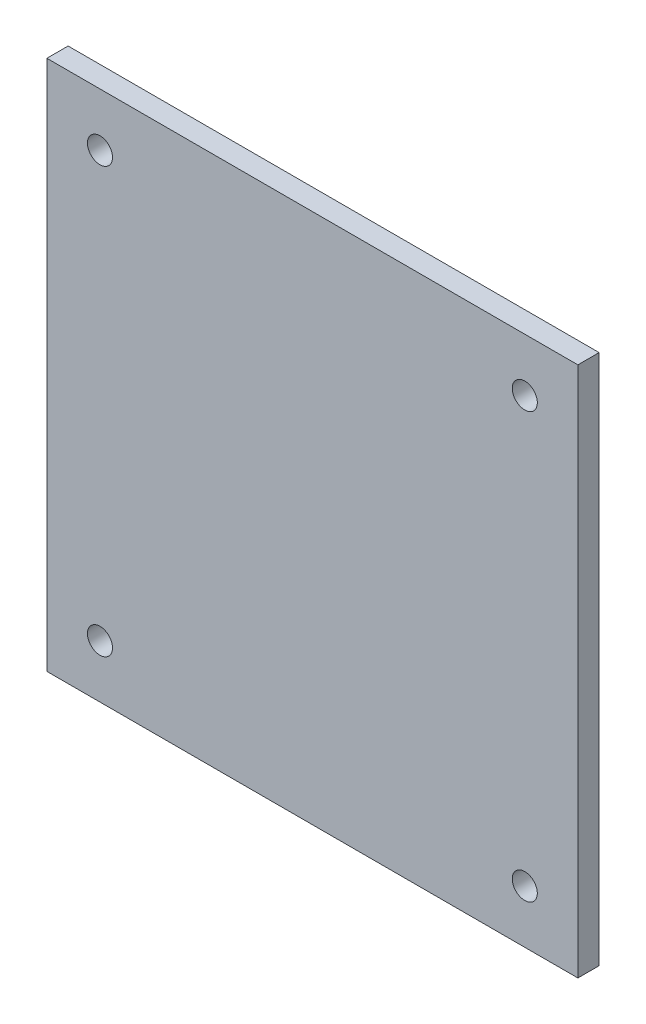
ISO-10303-21;
HEADER;
FILE_DESCRIPTION(('STEP AP214'),'2;1');
FILE_NAME('part.step','',(''),(''),'','','');
FILE_SCHEMA(('AUTOMOTIVE_DESIGN { 1 0 10303 214 1 1 1 1 }'));
ENDSEC;
DATA;
#1=APPLICATION_CONTEXT('core data for automotive mechanical design processes');
#2=APPLICATION_PROTOCOL_DEFINITION('international standard','automotive_design',2000,#1);
#3=PRODUCT_CONTEXT('',#1,'mechanical');
#4=PRODUCT('Part','Part','',(#3));
#5=PRODUCT_RELATED_PRODUCT_CATEGORY('part','',(#4));
#6=PRODUCT_DEFINITION_FORMATION('','',#4);
#7=PRODUCT_DEFINITION_CONTEXT('part definition',#1,'design');
#8=PRODUCT_DEFINITION('design','',#6,#7);
#9=PRODUCT_DEFINITION_SHAPE('','',#8);
#10=(LENGTH_UNIT() NAMED_UNIT(*) SI_UNIT(.MILLI.,.METRE.));
#11=(NAMED_UNIT(*) PLANE_ANGLE_UNIT() SI_UNIT($,.RADIAN.));
#12=(NAMED_UNIT(*) SI_UNIT($,.STERADIAN.) SOLID_ANGLE_UNIT());
#13=UNCERTAINTY_MEASURE_WITH_UNIT(LENGTH_MEASURE(1.E-05),#10,'distance_accuracy_value','');
#14=(GEOMETRIC_REPRESENTATION_CONTEXT(3) GLOBAL_UNCERTAINTY_ASSIGNED_CONTEXT((#13)) GLOBAL_UNIT_ASSIGNED_CONTEXT((#10,
#11,#12)) REPRESENTATION_CONTEXT('',''));
#15=CARTESIAN_POINT('',(0.,0.,0.));
#16=DIRECTION('',(0.,0.,1.));
#17=DIRECTION('',(1.,0.,0.));
#18=AXIS2_PLACEMENT_3D('',#15,#16,#17);
#19=CARTESIAN_POINT('',(57.15,6.35,0.));
#20=DIRECTION('',(0.,0.,1.));
#21=DIRECTION('',(1.,0.,0.));
#22=AXIS2_PLACEMENT_3D('',#19,#20,#21);
#23=CYLINDRICAL_SURFACE('',#22,1.5);
#24=CARTESIAN_POINT('',(57.15,6.35,0.));
#25=DIRECTION('',(0.,0.,1.));
#26=DIRECTION('',(1.,0.,0.));
#27=AXIS2_PLACEMENT_3D('',#24,#25,#26);
#28=CIRCLE('',#27,1.5);
#29=CARTESIAN_POINT('',(58.65,6.35,0.));
#30=VERTEX_POINT('',#29);
#31=EDGE_CURVE('E54',#30,#30,#28,.T.);
#32=ORIENTED_EDGE('',*,*,#31,.F.);
#33=EDGE_LOOP('',(#32));
#34=FACE_BOUND('',#33,.T.);
#35=CARTESIAN_POINT('',(57.15,6.35,2.54));
#36=DIRECTION('',(0.,0.,1.));
#37=DIRECTION('',(1.,0.,0.));
#38=AXIS2_PLACEMENT_3D('',#35,#36,#37);
#39=CIRCLE('',#38,1.5);
#40=CARTESIAN_POINT('',(58.65,6.35,2.54));
#41=VERTEX_POINT('',#40);
#42=EDGE_CURVE('E11',#41,#41,#39,.T.);
#43=ORIENTED_EDGE('',*,*,#42,.T.);
#44=EDGE_LOOP('',(#43));
#45=FACE_BOUND('',#44,.T.);
#46=ADVANCED_FACE('F45',(#34,#45),#23,.F.);
#47=CARTESIAN_POINT('',(6.35,6.35,0.));
#48=DIRECTION('',(0.,0.,1.));
#49=DIRECTION('',(1.,0.,0.));
#50=AXIS2_PLACEMENT_3D('',#47,#48,#49);
#51=CYLINDRICAL_SURFACE('',#50,1.5);
#52=CARTESIAN_POINT('',(6.35,6.35,0.));
#53=DIRECTION('',(0.,0.,1.));
#54=DIRECTION('',(1.,0.,0.));
#55=AXIS2_PLACEMENT_3D('',#52,#53,#54);
#56=CIRCLE('',#55,1.5);
#57=CARTESIAN_POINT('',(7.85,6.35,0.));
#58=VERTEX_POINT('',#57);
#59=EDGE_CURVE('E135',#58,#58,#56,.T.);
#60=ORIENTED_EDGE('',*,*,#59,.F.);
#61=EDGE_LOOP('',(#60));
#62=FACE_BOUND('',#61,.T.);
#63=CARTESIAN_POINT('',(6.35,6.35,2.54));
#64=DIRECTION('',(0.,0.,1.));
#65=DIRECTION('',(1.,0.,0.));
#66=AXIS2_PLACEMENT_3D('',#63,#64,#65);
#67=CIRCLE('',#66,1.5);
#68=CARTESIAN_POINT('',(7.85,6.35,2.54));
#69=VERTEX_POINT('',#68);
#70=EDGE_CURVE('E139',#69,#69,#67,.T.);
#71=ORIENTED_EDGE('',*,*,#70,.T.);
#72=EDGE_LOOP('',(#71));
#73=FACE_BOUND('',#72,.T.);
#74=ADVANCED_FACE('F150',(#62,#73),#51,.F.);
#75=CARTESIAN_POINT('',(0.,0.,2.54));
#76=DIRECTION('',(1.,0.,0.));
#77=DIRECTION('',(0.,0.,-1.));
#78=AXIS2_PLACEMENT_3D('',#75,#76,#77);
#79=PLANE('',#78);
#80=DIRECTION('',(0.,-1.,0.));
#81=VECTOR('',#80,1.);
#82=CARTESIAN_POINT('',(0.,0.,0.));
#83=LINE('',#82,#81);
#84=CARTESIAN_POINT('',(0.,63.5,0.));
#85=VERTEX_POINT('',#84);
#86=CARTESIAN_POINT('',(0.,0.,0.));
#87=VERTEX_POINT('',#86);
#88=EDGE_CURVE('E118',#85,#87,#83,.T.);
#89=ORIENTED_EDGE('',*,*,#88,.T.);
#90=DIRECTION('',(0.,0.,-1.));
#91=VECTOR('',#90,1.);
#92=CARTESIAN_POINT('',(0.,0.,2.54));
#93=LINE('',#92,#91);
#94=CARTESIAN_POINT('',(0.,0.,2.54));
#95=VERTEX_POINT('',#94);
#96=EDGE_CURVE('E107',#95,#87,#93,.T.);
#97=ORIENTED_EDGE('',*,*,#96,.F.);
#98=DIRECTION('',(0.,-1.,0.));
#99=VECTOR('',#98,1.);
#100=CARTESIAN_POINT('',(0.,0.,2.54));
#101=LINE('',#100,#99);
#102=CARTESIAN_POINT('',(0.,63.5,2.54));
#103=VERTEX_POINT('',#102);
#104=EDGE_CURVE('E99',#103,#95,#101,.T.);
#105=ORIENTED_EDGE('',*,*,#104,.F.);
#106=DIRECTION('',(0.,0.,-1.));
#107=VECTOR('',#106,1.);
#108=CARTESIAN_POINT('',(0.,63.5,2.54));
#109=LINE('',#108,#107);
#110=EDGE_CURVE('E114',#103,#85,#109,.T.);
#111=ORIENTED_EDGE('',*,*,#110,.T.);
#112=EDGE_LOOP('',(#89,#97,#105,#111));
#113=FACE_BOUND('',#112,.T.);
#114=ADVANCED_FACE('F174',(#113),#79,.F.);
#115=CARTESIAN_POINT('',(0.,0.,2.54));
#116=DIRECTION('',(0.,1.,0.));
#117=DIRECTION('',(0.,0.,1.));
#118=AXIS2_PLACEMENT_3D('',#115,#116,#117);
#119=PLANE('',#118);
#120=DIRECTION('',(1.,0.,0.));
#121=VECTOR('',#120,1.);
#122=CARTESIAN_POINT('',(0.,0.,0.));
#123=LINE('',#122,#121);
#124=CARTESIAN_POINT('',(63.5,0.,0.));
#125=VERTEX_POINT('',#124);
#126=EDGE_CURVE('E105',#87,#125,#123,.T.);
#127=ORIENTED_EDGE('',*,*,#126,.T.);
#128=DIRECTION('',(0.,0.,-1.));
#129=VECTOR('',#128,1.);
#130=CARTESIAN_POINT('',(63.5,0.,2.54));
#131=LINE('',#130,#129);
#132=CARTESIAN_POINT('',(63.5,0.,2.54));
#133=VERTEX_POINT('',#132);
#134=EDGE_CURVE('E103',#133,#125,#131,.T.);
#135=ORIENTED_EDGE('',*,*,#134,.F.);
#136=DIRECTION('',(1.,0.,0.));
#137=VECTOR('',#136,1.);
#138=CARTESIAN_POINT('',(0.,0.,2.54));
#139=LINE('',#138,#137);
#140=EDGE_CURVE('E93',#95,#133,#139,.T.);
#141=ORIENTED_EDGE('',*,*,#140,.F.);
#142=ORIENTED_EDGE('',*,*,#96,.T.);
#143=EDGE_LOOP('',(#127,#135,#141,#142));
#144=FACE_BOUND('',#143,.T.);
#145=ADVANCED_FACE('F104',(#144),#119,.F.);
#146=CARTESIAN_POINT('',(63.5,0.,2.54));
#147=DIRECTION('',(-1.,0.,0.));
#148=DIRECTION('',(0.,0.,1.));
#149=AXIS2_PLACEMENT_3D('',#146,#147,#148);
#150=PLANE('',#149);
#151=DIRECTION('',(0.,1.,0.));
#152=VECTOR('',#151,1.);
#153=CARTESIAN_POINT('',(63.5,0.,0.));
#154=LINE('',#153,#152);
#155=CARTESIAN_POINT('',(63.5,63.5,0.));
#156=VERTEX_POINT('',#155);
#157=EDGE_CURVE('E79',#125,#156,#154,.T.);
#158=ORIENTED_EDGE('',*,*,#157,.T.);
#159=DIRECTION('',(0.,0.,-1.));
#160=VECTOR('',#159,1.);
#161=CARTESIAN_POINT('',(63.5,63.5,2.54));
#162=LINE('',#161,#160);
#163=CARTESIAN_POINT('',(63.5,63.5,2.54));
#164=VERTEX_POINT('',#163);
#165=EDGE_CURVE('E108',#164,#156,#162,.T.);
#166=ORIENTED_EDGE('',*,*,#165,.F.);
#167=DIRECTION('',(0.,1.,0.));
#168=VECTOR('',#167,1.);
#169=CARTESIAN_POINT('',(63.5,0.,2.54));
#170=LINE('',#169,#168);
#171=EDGE_CURVE('E97',#133,#164,#170,.T.);
#172=ORIENTED_EDGE('',*,*,#171,.F.);
#173=ORIENTED_EDGE('',*,*,#134,.T.);
#174=EDGE_LOOP('',(#158,#166,#172,#173));
#175=FACE_BOUND('',#174,.T.);
#176=ADVANCED_FACE('F110',(#175),#150,.F.);
#177=CARTESIAN_POINT('',(0.,63.5,2.54));
#178=DIRECTION('',(0.,-1.,0.));
#179=DIRECTION('',(0.,0.,-1.));
#180=AXIS2_PLACEMENT_3D('',#177,#178,#179);
#181=PLANE('',#180);
#182=DIRECTION('',(-1.,0.,0.));
#183=VECTOR('',#182,1.);
#184=CARTESIAN_POINT('',(0.,63.5,0.));
#185=LINE('',#184,#183);
#186=EDGE_CURVE('E85',#156,#85,#185,.T.);
#187=ORIENTED_EDGE('',*,*,#186,.T.);
#188=ORIENTED_EDGE('',*,*,#110,.F.);
#189=DIRECTION('',(-1.,0.,0.));
#190=VECTOR('',#189,1.);
#191=CARTESIAN_POINT('',(0.,63.5,2.54));
#192=LINE('',#191,#190);
#193=EDGE_CURVE('E62',#164,#103,#192,.T.);
#194=ORIENTED_EDGE('',*,*,#193,.F.);
#195=ORIENTED_EDGE('',*,*,#165,.T.);
#196=EDGE_LOOP('',(#187,#188,#194,#195));
#197=FACE_BOUND('',#196,.T.);
#198=ADVANCED_FACE('F154',(#197),#181,.F.);
#199=CARTESIAN_POINT('',(0.,0.,2.54));
#200=DIRECTION('',(0.,0.,-1.));
#201=DIRECTION('',(-1.,0.,0.));
#202=AXIS2_PLACEMENT_3D('',#199,#200,#201);
#203=PLANE('',#202);
#204=CARTESIAN_POINT('',(57.15,57.15,2.54));
#205=DIRECTION('',(0.,0.,1.));
#206=DIRECTION('',(1.,0.,0.));
#207=AXIS2_PLACEMENT_3D('',#204,#205,#206);
#208=CIRCLE('',#207,1.5);
#209=CARTESIAN_POINT('',(58.65,57.15,2.54));
#210=VERTEX_POINT('',#209);
#211=EDGE_CURVE('E291',#210,#210,#208,.T.);
#212=ORIENTED_EDGE('',*,*,#211,.F.);
#213=EDGE_LOOP('',(#212));
#214=FACE_BOUND('',#213,.T.);
#215=CARTESIAN_POINT('',(6.35,57.15,2.54));
#216=DIRECTION('',(0.,0.,1.));
#217=DIRECTION('',(1.,0.,0.));
#218=AXIS2_PLACEMENT_3D('',#215,#216,#217);
#219=CIRCLE('',#218,1.5);
#220=CARTESIAN_POINT('',(7.85,57.15,2.54));
#221=VERTEX_POINT('',#220);
#222=EDGE_CURVE('E293',#221,#221,#219,.T.);
#223=ORIENTED_EDGE('',*,*,#222,.F.);
#224=EDGE_LOOP('',(#223));
#225=FACE_BOUND('',#224,.T.);
#226=ORIENTED_EDGE('',*,*,#104,.T.);
#227=ORIENTED_EDGE('',*,*,#140,.T.);
#228=ORIENTED_EDGE('',*,*,#171,.T.);
#229=ORIENTED_EDGE('',*,*,#193,.T.);
#230=EDGE_LOOP('',(#226,#227,#228,#229));
#231=FACE_BOUND('',#230,.T.);
#232=ORIENTED_EDGE('',*,*,#70,.F.);
#233=EDGE_LOOP('',(#232));
#234=FACE_BOUND('',#233,.T.);
#235=ORIENTED_EDGE('',*,*,#42,.F.);
#236=EDGE_LOOP('',(#235));
#237=FACE_BOUND('',#236,.T.);
#238=ADVANCED_FACE('F94',(#214,#225,#231,#234,#237),#203,.F.);
#239=CARTESIAN_POINT('',(0.,0.,0.));
#240=DIRECTION('',(0.,0.,-1.));
#241=DIRECTION('',(-1.,0.,0.));
#242=AXIS2_PLACEMENT_3D('',#239,#240,#241);
#243=PLANE('',#242);
#244=CARTESIAN_POINT('',(57.15,57.15,0.));
#245=DIRECTION('',(0.,0.,1.));
#246=DIRECTION('',(1.,0.,0.));
#247=AXIS2_PLACEMENT_3D('',#244,#245,#246);
#248=CIRCLE('',#247,1.5);
#249=CARTESIAN_POINT('',(58.65,57.15,0.));
#250=VERTEX_POINT('',#249);
#251=EDGE_CURVE('E289',#250,#250,#248,.T.);
#252=ORIENTED_EDGE('',*,*,#251,.T.);
#253=EDGE_LOOP('',(#252));
#254=FACE_BOUND('',#253,.T.);
#255=CARTESIAN_POINT('',(6.35,57.15,0.));
#256=DIRECTION('',(0.,0.,1.));
#257=DIRECTION('',(1.,0.,0.));
#258=AXIS2_PLACEMENT_3D('',#255,#256,#257);
#259=CIRCLE('',#258,1.5);
#260=CARTESIAN_POINT('',(7.85,57.15,0.));
#261=VERTEX_POINT('',#260);
#262=EDGE_CURVE('E122',#261,#261,#259,.T.);
#263=ORIENTED_EDGE('',*,*,#262,.T.);
#264=EDGE_LOOP('',(#263));
#265=FACE_BOUND('',#264,.T.);
#266=ORIENTED_EDGE('',*,*,#88,.F.);
#267=ORIENTED_EDGE('',*,*,#186,.F.);
#268=ORIENTED_EDGE('',*,*,#157,.F.);
#269=ORIENTED_EDGE('',*,*,#126,.F.);
#270=EDGE_LOOP('',(#266,#267,#268,#269));
#271=FACE_BOUND('',#270,.T.);
#272=ORIENTED_EDGE('',*,*,#59,.T.);
#273=EDGE_LOOP('',(#272));
#274=FACE_BOUND('',#273,.T.);
#275=ORIENTED_EDGE('',*,*,#31,.T.);
#276=EDGE_LOOP('',(#275));
#277=FACE_BOUND('',#276,.T.);
#278=ADVANCED_FACE('F146',(#254,#265,#271,#274,#277),#243,.T.);
#279=CARTESIAN_POINT('',(6.35,57.15,0.));
#280=DIRECTION('',(0.,0.,1.));
#281=DIRECTION('',(1.,0.,0.));
#282=AXIS2_PLACEMENT_3D('',#279,#280,#281);
#283=CYLINDRICAL_SURFACE('',#282,1.5);
#284=ORIENTED_EDGE('',*,*,#262,.F.);
#285=EDGE_LOOP('',(#284));
#286=FACE_BOUND('',#285,.T.);
#287=ORIENTED_EDGE('',*,*,#222,.T.);
#288=EDGE_LOOP('',(#287));
#289=FACE_BOUND('',#288,.T.);
#290=ADVANCED_FACE('F161',(#286,#289),#283,.F.);
#291=CARTESIAN_POINT('',(57.15,57.15,0.));
#292=DIRECTION('',(0.,0.,1.));
#293=DIRECTION('',(1.,0.,0.));
#294=AXIS2_PLACEMENT_3D('',#291,#292,#293);
#295=CYLINDRICAL_SURFACE('',#294,1.5);
#296=ORIENTED_EDGE('',*,*,#251,.F.);
#297=EDGE_LOOP('',(#296));
#298=FACE_BOUND('',#297,.T.);
#299=ORIENTED_EDGE('',*,*,#211,.T.);
#300=EDGE_LOOP('',(#299));
#301=FACE_BOUND('',#300,.T.);
#302=ADVANCED_FACE('F223',(#298,#301),#295,.F.);
#303=CLOSED_SHELL('',(#46,#74,#114,#145,#176,#198,#238,#278,#290,#302));
#304=MANIFOLD_SOLID_BREP('B2',#303);
#305=ADVANCED_BREP_SHAPE_REPRESENTATION('',(#18,#304),#14);
#306=SHAPE_DEFINITION_REPRESENTATION(#9,#305);
ENDSEC;
END-ISO-10303-21;
